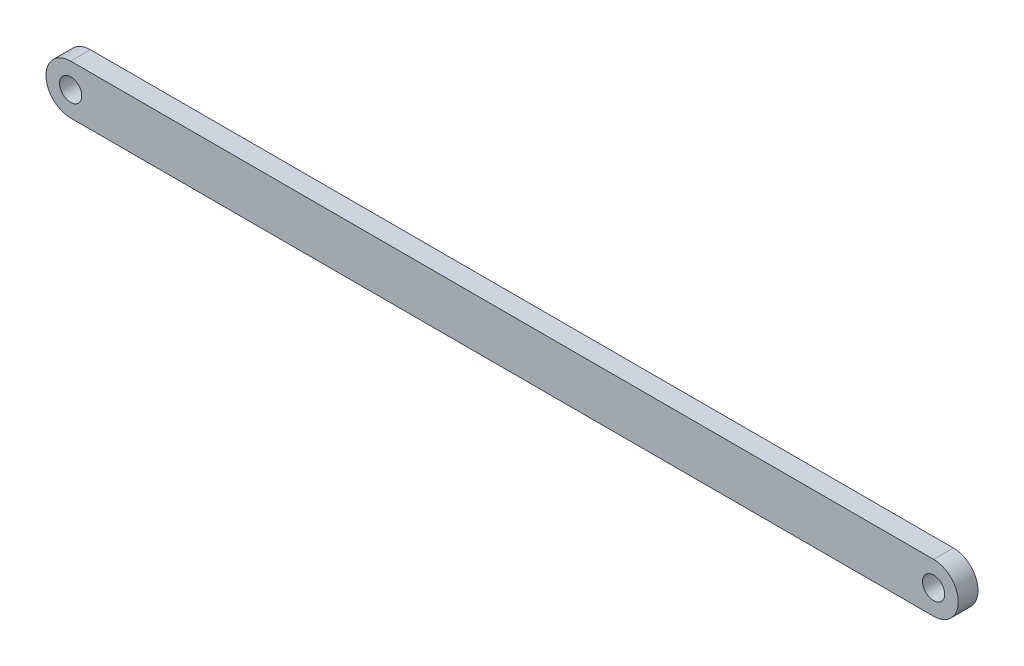
ISO-10303-21;
HEADER;
FILE_DESCRIPTION(('STEP AP214'),'2;1');
FILE_NAME('part.step','',(''),(''),'','','');
FILE_SCHEMA(('AUTOMOTIVE_DESIGN { 1 0 10303 214 1 1 1 1 }'));
ENDSEC;
DATA;
#1=APPLICATION_CONTEXT('core data for automotive mechanical design processes');
#2=APPLICATION_PROTOCOL_DEFINITION('international standard','automotive_design',2000,#1);
#3=PRODUCT_CONTEXT('',#1,'mechanical');
#4=PRODUCT('Part','Part','',(#3));
#5=PRODUCT_RELATED_PRODUCT_CATEGORY('part','',(#4));
#6=PRODUCT_DEFINITION_FORMATION('','',#4);
#7=PRODUCT_DEFINITION_CONTEXT('part definition',#1,'design');
#8=PRODUCT_DEFINITION('design','',#6,#7);
#9=PRODUCT_DEFINITION_SHAPE('','',#8);
#10=(LENGTH_UNIT() NAMED_UNIT(*) SI_UNIT(.MILLI.,.METRE.));
#11=(NAMED_UNIT(*) PLANE_ANGLE_UNIT() SI_UNIT($,.RADIAN.));
#12=(NAMED_UNIT(*) SI_UNIT($,.STERADIAN.) SOLID_ANGLE_UNIT());
#13=UNCERTAINTY_MEASURE_WITH_UNIT(LENGTH_MEASURE(1.E-05),#10,'distance_accuracy_value','');
#14=(GEOMETRIC_REPRESENTATION_CONTEXT(3) GLOBAL_UNCERTAINTY_ASSIGNED_CONTEXT((#13)) GLOBAL_UNIT_ASSIGNED_CONTEXT((#10,
#11,#12)) REPRESENTATION_CONTEXT('',''));
#15=CARTESIAN_POINT('',(0.,0.,0.));
#16=DIRECTION('',(0.,0.,1.));
#17=DIRECTION('',(1.,0.,0.));
#18=AXIS2_PLACEMENT_3D('',#15,#16,#17);
#19=CARTESIAN_POINT('',(0.,0.,2.));
#20=DIRECTION('',(0.,0.,1.));
#21=DIRECTION('',(1.,0.,0.));
#22=AXIS2_PLACEMENT_3D('',#19,#20,#21);
#23=PLANE('',#22);
#24=CARTESIAN_POINT('',(0.,0.,2.));
#25=DIRECTION('',(0.,0.,1.));
#26=DIRECTION('',(1.,0.,0.));
#27=AXIS2_PLACEMENT_3D('',#24,#25,#26);
#28=CIRCLE('',#27,2.25);
#29=CARTESIAN_POINT('',(2.25,0.,2.));
#30=VERTEX_POINT('',#29);
#31=EDGE_CURVE('E108',#30,#30,#28,.T.);
#32=ORIENTED_EDGE('',*,*,#31,.F.);
#33=EDGE_LOOP('',(#32));
#34=FACE_BOUND('',#33,.T.);
#35=CARTESIAN_POINT('',(0.,0.,2.));
#36=DIRECTION('',(0.,0.,1.));
#37=DIRECTION('',(1.,0.,0.));
#38=AXIS2_PLACEMENT_3D('',#35,#36,#37);
#39=CIRCLE('',#38,5.);
#40=CARTESIAN_POINT('',(0.,5.,2.));
#41=VERTEX_POINT('',#40);
#42=CARTESIAN_POINT('',(0.,-5.,2.));
#43=VERTEX_POINT('',#42);
#44=EDGE_CURVE('E93',#41,#43,#39,.T.);
#45=ORIENTED_EDGE('',*,*,#44,.T.);
#46=DIRECTION('',(1.,0.,0.));
#47=VECTOR('',#46,1.);
#48=CARTESIAN_POINT('',(0.,-5.,2.));
#49=LINE('',#48,#47);
#50=CARTESIAN_POINT('',(175.,-5.,2.));
#51=VERTEX_POINT('',#50);
#52=EDGE_CURVE('E88',#43,#51,#49,.T.);
#53=ORIENTED_EDGE('',*,*,#52,.T.);
#54=CARTESIAN_POINT('',(175.,0.,2.));
#55=DIRECTION('',(0.,0.,1.));
#56=DIRECTION('',(1.,0.,0.));
#57=AXIS2_PLACEMENT_3D('',#54,#55,#56);
#58=CIRCLE('',#57,5.);
#59=CARTESIAN_POINT('',(175.,5.,2.));
#60=VERTEX_POINT('',#59);
#61=EDGE_CURVE('E91',#51,#60,#58,.T.);
#62=ORIENTED_EDGE('',*,*,#61,.T.);
#63=DIRECTION('',(-1.,0.,0.));
#64=VECTOR('',#63,1.);
#65=CARTESIAN_POINT('',(0.,5.,2.));
#66=LINE('',#65,#64);
#67=EDGE_CURVE('E58',#60,#41,#66,.T.);
#68=ORIENTED_EDGE('',*,*,#67,.T.);
#69=EDGE_LOOP('',(#45,#53,#62,#68));
#70=FACE_BOUND('',#69,.T.);
#71=CARTESIAN_POINT('',(175.,0.,2.));
#72=DIRECTION('',(0.,0.,1.));
#73=DIRECTION('',(1.,0.,0.));
#74=AXIS2_PLACEMENT_3D('',#71,#72,#73);
#75=CIRCLE('',#74,2.25000000000001);
#76=CARTESIAN_POINT('',(177.25,0.,2.));
#77=VERTEX_POINT('',#76);
#78=EDGE_CURVE('E123',#77,#77,#75,.T.);
#79=ORIENTED_EDGE('',*,*,#78,.F.);
#80=EDGE_LOOP('',(#79));
#81=FACE_BOUND('',#80,.T.);
#82=ADVANCED_FACE('F41',(#34,#70,#81),#23,.T.);
#83=CARTESIAN_POINT('',(0.,0.,-2.));
#84=DIRECTION('',(0.,0.,1.));
#85=DIRECTION('',(1.,0.,0.));
#86=AXIS2_PLACEMENT_3D('',#83,#84,#85);
#87=PLANE('',#86);
#88=CARTESIAN_POINT('',(0.,0.,-2.));
#89=DIRECTION('',(0.,0.,1.));
#90=DIRECTION('',(1.,0.,0.));
#91=AXIS2_PLACEMENT_3D('',#88,#89,#90);
#92=CIRCLE('',#91,5.);
#93=CARTESIAN_POINT('',(0.,5.,-2.));
#94=VERTEX_POINT('',#93);
#95=CARTESIAN_POINT('',(0.,-5.,-2.));
#96=VERTEX_POINT('',#95);
#97=EDGE_CURVE('E105',#94,#96,#92,.T.);
#98=ORIENTED_EDGE('',*,*,#97,.F.);
#99=DIRECTION('',(-1.,0.,0.));
#100=VECTOR('',#99,1.);
#101=CARTESIAN_POINT('',(0.,5.,-2.));
#102=LINE('',#101,#100);
#103=CARTESIAN_POINT('',(175.,5.,-2.));
#104=VERTEX_POINT('',#103);
#105=EDGE_CURVE('E81',#104,#94,#102,.T.);
#106=ORIENTED_EDGE('',*,*,#105,.F.);
#107=CARTESIAN_POINT('',(175.,0.,-2.));
#108=DIRECTION('',(0.,0.,1.));
#109=DIRECTION('',(1.,0.,0.));
#110=AXIS2_PLACEMENT_3D('',#107,#108,#109);
#111=CIRCLE('',#110,5.);
#112=CARTESIAN_POINT('',(175.,-5.,-2.));
#113=VERTEX_POINT('',#112);
#114=EDGE_CURVE('E75',#113,#104,#111,.T.);
#115=ORIENTED_EDGE('',*,*,#114,.F.);
#116=DIRECTION('',(1.,0.,0.));
#117=VECTOR('',#116,1.);
#118=CARTESIAN_POINT('',(0.,-5.,-2.));
#119=LINE('',#118,#117);
#120=EDGE_CURVE('E97',#96,#113,#119,.T.);
#121=ORIENTED_EDGE('',*,*,#120,.F.);
#122=EDGE_LOOP('',(#98,#106,#115,#121));
#123=FACE_BOUND('',#122,.T.);
#124=CARTESIAN_POINT('',(0.,0.,-2.));
#125=DIRECTION('',(0.,0.,1.));
#126=DIRECTION('',(1.,0.,0.));
#127=AXIS2_PLACEMENT_3D('',#124,#125,#126);
#128=CIRCLE('',#127,2.25);
#129=CARTESIAN_POINT('',(2.25,0.,-2.));
#130=VERTEX_POINT('',#129);
#131=EDGE_CURVE('E120',#130,#130,#128,.T.);
#132=ORIENTED_EDGE('',*,*,#131,.T.);
#133=EDGE_LOOP('',(#132));
#134=FACE_BOUND('',#133,.T.);
#135=CARTESIAN_POINT('',(175.,0.,-2.));
#136=DIRECTION('',(0.,0.,1.));
#137=DIRECTION('',(1.,0.,0.));
#138=AXIS2_PLACEMENT_3D('',#135,#136,#137);
#139=CIRCLE('',#138,2.25000000000001);
#140=CARTESIAN_POINT('',(177.25,0.,-2.));
#141=VERTEX_POINT('',#140);
#142=EDGE_CURVE('E126',#141,#141,#139,.T.);
#143=ORIENTED_EDGE('',*,*,#142,.T.);
#144=EDGE_LOOP('',(#143));
#145=FACE_BOUND('',#144,.T.);
#146=ADVANCED_FACE('F116',(#123,#134,#145),#87,.F.);
#147=CARTESIAN_POINT('',(0.,0.,2.));
#148=DIRECTION('',(0.,0.,-1.));
#149=DIRECTION('',(-1.,0.,0.));
#150=AXIS2_PLACEMENT_3D('',#147,#148,#149);
#151=CYLINDRICAL_SURFACE('',#150,5.);
#152=ORIENTED_EDGE('',*,*,#97,.T.);
#153=DIRECTION('',(0.,0.,-1.));
#154=VECTOR('',#153,1.);
#155=CARTESIAN_POINT('',(0.,-5.,2.));
#156=LINE('',#155,#154);
#157=EDGE_CURVE('E11',#43,#96,#156,.T.);
#158=ORIENTED_EDGE('',*,*,#157,.F.);
#159=ORIENTED_EDGE('',*,*,#44,.F.);
#160=DIRECTION('',(0.,0.,-1.));
#161=VECTOR('',#160,1.);
#162=CARTESIAN_POINT('',(0.,5.,2.));
#163=LINE('',#162,#161);
#164=EDGE_CURVE('E101',#41,#94,#163,.T.);
#165=ORIENTED_EDGE('',*,*,#164,.T.);
#166=EDGE_LOOP('',(#152,#158,#159,#165));
#167=FACE_BOUND('',#166,.T.);
#168=ADVANCED_FACE('F43',(#167),#151,.T.);
#169=CARTESIAN_POINT('',(0.,-5.,2.));
#170=DIRECTION('',(0.,1.,0.));
#171=DIRECTION('',(0.,0.,1.));
#172=AXIS2_PLACEMENT_3D('',#169,#170,#171);
#173=PLANE('',#172);
#174=ORIENTED_EDGE('',*,*,#120,.T.);
#175=DIRECTION('',(0.,0.,-1.));
#176=VECTOR('',#175,1.);
#177=CARTESIAN_POINT('',(175.,-5.,2.));
#178=LINE('',#177,#176);
#179=EDGE_CURVE('E50',#51,#113,#178,.T.);
#180=ORIENTED_EDGE('',*,*,#179,.F.);
#181=ORIENTED_EDGE('',*,*,#52,.F.);
#182=ORIENTED_EDGE('',*,*,#157,.T.);
#183=EDGE_LOOP('',(#174,#180,#181,#182));
#184=FACE_BOUND('',#183,.T.);
#185=ADVANCED_FACE('F96',(#184),#173,.F.);
#186=CARTESIAN_POINT('',(175.,0.,2.));
#187=DIRECTION('',(0.,0.,-1.));
#188=DIRECTION('',(-1.,0.,0.));
#189=AXIS2_PLACEMENT_3D('',#186,#187,#188);
#190=CYLINDRICAL_SURFACE('',#189,5.);
#191=ORIENTED_EDGE('',*,*,#114,.T.);
#192=DIRECTION('',(0.,0.,-1.));
#193=VECTOR('',#192,1.);
#194=CARTESIAN_POINT('',(175.,5.,2.));
#195=LINE('',#194,#193);
#196=EDGE_CURVE('E98',#60,#104,#195,.T.);
#197=ORIENTED_EDGE('',*,*,#196,.F.);
#198=ORIENTED_EDGE('',*,*,#61,.F.);
#199=ORIENTED_EDGE('',*,*,#179,.T.);
#200=EDGE_LOOP('',(#191,#197,#198,#199));
#201=FACE_BOUND('',#200,.T.);
#202=ADVANCED_FACE('F99',(#201),#190,.T.);
#203=CARTESIAN_POINT('',(0.,5.,2.));
#204=DIRECTION('',(0.,-1.,0.));
#205=DIRECTION('',(0.,0.,-1.));
#206=AXIS2_PLACEMENT_3D('',#203,#204,#205);
#207=PLANE('',#206);
#208=ORIENTED_EDGE('',*,*,#105,.T.);
#209=ORIENTED_EDGE('',*,*,#164,.F.);
#210=ORIENTED_EDGE('',*,*,#67,.F.);
#211=ORIENTED_EDGE('',*,*,#196,.T.);
#212=EDGE_LOOP('',(#208,#209,#210,#211));
#213=FACE_BOUND('',#212,.T.);
#214=ADVANCED_FACE('F113',(#213),#207,.F.);
#215=CARTESIAN_POINT('',(0.,0.,2.));
#216=DIRECTION('',(0.,0.,-1.));
#217=DIRECTION('',(-1.,0.,0.));
#218=AXIS2_PLACEMENT_3D('',#215,#216,#217);
#219=CYLINDRICAL_SURFACE('',#218,2.25);
#220=ORIENTED_EDGE('',*,*,#31,.T.);
#221=EDGE_LOOP('',(#220));
#222=FACE_BOUND('',#221,.T.);
#223=ORIENTED_EDGE('',*,*,#131,.F.);
#224=EDGE_LOOP('',(#223));
#225=FACE_BOUND('',#224,.T.);
#226=ADVANCED_FACE('F143',(#222,#225),#219,.F.);
#227=CARTESIAN_POINT('',(175.,0.,2.));
#228=DIRECTION('',(0.,0.,-1.));
#229=DIRECTION('',(-1.,0.,0.));
#230=AXIS2_PLACEMENT_3D('',#227,#228,#229);
#231=CYLINDRICAL_SURFACE('',#230,2.25000000000001);
#232=ORIENTED_EDGE('',*,*,#78,.T.);
#233=EDGE_LOOP('',(#232));
#234=FACE_BOUND('',#233,.T.);
#235=ORIENTED_EDGE('',*,*,#142,.F.);
#236=EDGE_LOOP('',(#235));
#237=FACE_BOUND('',#236,.T.);
#238=ADVANCED_FACE('F132',(#234,#237),#231,.F.);
#239=CLOSED_SHELL('',(#82,#146,#168,#185,#202,#214,#226,#238));
#240=MANIFOLD_SOLID_BREP('B2',#239);
#241=ADVANCED_BREP_SHAPE_REPRESENTATION('',(#18,#240),#14);
#242=SHAPE_DEFINITION_REPRESENTATION(#9,#241);
ENDSEC;
END-ISO-10303-21;
